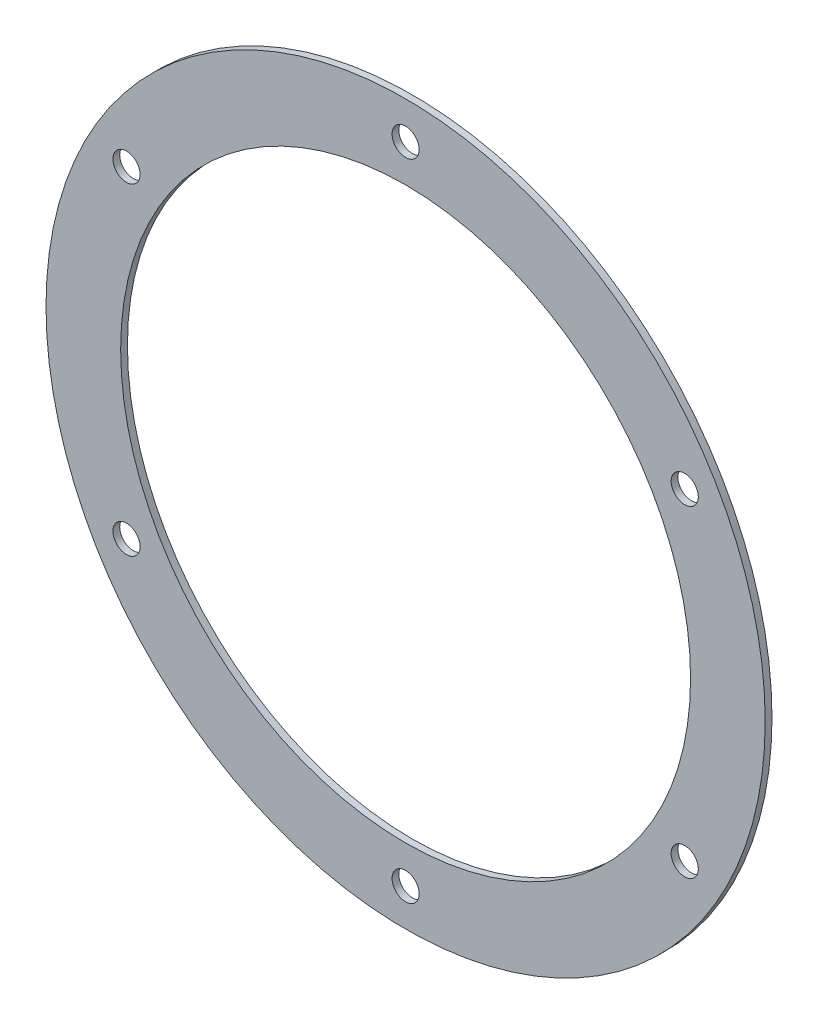
ISO-10303-21;
HEADER;
FILE_DESCRIPTION(('STEP AP214'),'2;1');
FILE_NAME('part.step','',(''),(''),'','','');
FILE_SCHEMA(('AUTOMOTIVE_DESIGN { 1 0 10303 214 1 1 1 1 }'));
ENDSEC;
DATA;
#1=APPLICATION_CONTEXT('core data for automotive mechanical design processes');
#2=APPLICATION_PROTOCOL_DEFINITION('international standard','automotive_design',2000,#1);
#3=PRODUCT_CONTEXT('',#1,'mechanical');
#4=PRODUCT('Part','Part','',(#3));
#5=PRODUCT_RELATED_PRODUCT_CATEGORY('part','',(#4));
#6=PRODUCT_DEFINITION_FORMATION('','',#4);
#7=PRODUCT_DEFINITION_CONTEXT('part definition',#1,'design');
#8=PRODUCT_DEFINITION('design','',#6,#7);
#9=PRODUCT_DEFINITION_SHAPE('','',#8);
#10=(LENGTH_UNIT() NAMED_UNIT(*) SI_UNIT(.MILLI.,.METRE.));
#11=(NAMED_UNIT(*) PLANE_ANGLE_UNIT() SI_UNIT($,.RADIAN.));
#12=(NAMED_UNIT(*) SI_UNIT($,.STERADIAN.) SOLID_ANGLE_UNIT());
#13=UNCERTAINTY_MEASURE_WITH_UNIT(LENGTH_MEASURE(1.E-05),#10,'distance_accuracy_value','');
#14=(GEOMETRIC_REPRESENTATION_CONTEXT(3) GLOBAL_UNCERTAINTY_ASSIGNED_CONTEXT((#13)) GLOBAL_UNIT_ASSIGNED_CONTEXT((#10,
#11,#12)) REPRESENTATION_CONTEXT('',''));
#15=CARTESIAN_POINT('',(0.,0.,0.));
#16=DIRECTION('',(0.,0.,1.));
#17=DIRECTION('',(1.,0.,0.));
#18=AXIS2_PLACEMENT_3D('',#15,#16,#17);
#19=CARTESIAN_POINT('',(0.,0.,1.));
#20=DIRECTION('',(0.,0.,-1.));
#21=DIRECTION('',(-1.,0.,0.));
#22=AXIS2_PLACEMENT_3D('',#19,#20,#21);
#23=CYLINDRICAL_SURFACE('',#22,53.);
#24=CARTESIAN_POINT('',(0.,0.,1.));
#25=DIRECTION('',(0.,0.,1.));
#26=DIRECTION('',(1.,0.,0.));
#27=AXIS2_PLACEMENT_3D('',#24,#25,#26);
#28=CIRCLE('',#27,53.);
#29=CARTESIAN_POINT('',(53.,0.,1.));
#30=VERTEX_POINT('',#29);
#31=EDGE_CURVE('E11',#30,#30,#28,.T.);
#32=ORIENTED_EDGE('',*,*,#31,.F.);
#33=EDGE_LOOP('',(#32));
#34=FACE_BOUND('',#33,.T.);
#35=CARTESIAN_POINT('',(0.,0.,0.));
#36=DIRECTION('',(0.,0.,1.));
#37=DIRECTION('',(1.,0.,0.));
#38=AXIS2_PLACEMENT_3D('',#35,#36,#37);
#39=CIRCLE('',#38,53.);
#40=CARTESIAN_POINT('',(53.,0.,0.));
#41=VERTEX_POINT('',#40);
#42=EDGE_CURVE('E86',#41,#41,#39,.T.);
#43=ORIENTED_EDGE('',*,*,#42,.T.);
#44=EDGE_LOOP('',(#43));
#45=FACE_BOUND('',#44,.T.);
#46=ADVANCED_FACE('F83',(#34,#45),#23,.T.);
#47=CARTESIAN_POINT('',(0.,0.,1.));
#48=DIRECTION('',(0.,0.,1.));
#49=DIRECTION('',(1.,0.,0.));
#50=AXIS2_PLACEMENT_3D('',#47,#48,#49);
#51=PLANE('',#50);
#52=CARTESIAN_POINT('',(-41.1362066797649,-23.7499999999977,1.));
#53=DIRECTION('',(0.,0.,1.));
#54=DIRECTION('',(1.,0.,0.));
#55=AXIS2_PLACEMENT_3D('',#52,#53,#54);
#56=CIRCLE('',#55,2.);
#57=CARTESIAN_POINT('',(-43.1362066797649,-23.7499999999977,1.));
#58=VERTEX_POINT('',#57);
#59=EDGE_CURVE('E95',#58,#58,#56,.T.);
#60=ORIENTED_EDGE('',*,*,#59,.F.);
#61=EDGE_LOOP('',(#60));
#62=FACE_BOUND('',#61,.T.);
#63=CARTESIAN_POINT('',(0.,0.,1.));
#64=DIRECTION('',(0.,0.,1.));
#65=DIRECTION('',(1.,0.,0.));
#66=AXIS2_PLACEMENT_3D('',#63,#64,#65);
#67=CIRCLE('',#66,42.);
#68=CARTESIAN_POINT('',(-42.,0.,1.));
#69=VERTEX_POINT('',#68);
#70=EDGE_CURVE('E100',#69,#69,#67,.T.);
#71=ORIENTED_EDGE('',*,*,#70,.F.);
#72=EDGE_LOOP('',(#71));
#73=FACE_BOUND('',#72,.T.);
#74=CARTESIAN_POINT('',(-5.38267357488891E-12,-47.5,1.));
#75=DIRECTION('',(0.,0.,1.));
#76=DIRECTION('',(1.,0.,0.));
#77=AXIS2_PLACEMENT_3D('',#74,#75,#76);
#78=CIRCLE('',#77,2.);
#79=CARTESIAN_POINT('',(-2.00000000000538,-47.5,1.));
#80=VERTEX_POINT('',#79);
#81=EDGE_CURVE('E104',#80,#80,#78,.T.);
#82=ORIENTED_EDGE('',*,*,#81,.F.);
#83=EDGE_LOOP('',(#82));
#84=FACE_BOUND('',#83,.T.);
#85=CARTESIAN_POINT('',(41.1362066797568,-23.7500000000023,1.));
#86=DIRECTION('',(0.,0.,1.));
#87=DIRECTION('',(1.,0.,0.));
#88=AXIS2_PLACEMENT_3D('',#85,#86,#87);
#89=CIRCLE('',#88,2.);
#90=CARTESIAN_POINT('',(39.1362066797568,-23.7500000000023,1.));
#91=VERTEX_POINT('',#90);
#92=EDGE_CURVE('E108',#91,#91,#89,.T.);
#93=ORIENTED_EDGE('',*,*,#92,.F.);
#94=EDGE_LOOP('',(#93));
#95=FACE_BOUND('',#94,.T.);
#96=CARTESIAN_POINT('',(0.,47.5,1.));
#97=DIRECTION('',(0.,0.,1.));
#98=DIRECTION('',(1.,0.,0.));
#99=AXIS2_PLACEMENT_3D('',#96,#97,#98);
#100=CIRCLE('',#99,2.);
#101=CARTESIAN_POINT('',(-2.,47.5,1.));
#102=VERTEX_POINT('',#101);
#103=EDGE_CURVE('E112',#102,#102,#100,.T.);
#104=ORIENTED_EDGE('',*,*,#103,.F.);
#105=EDGE_LOOP('',(#104));
#106=FACE_BOUND('',#105,.T.);
#107=CARTESIAN_POINT('',(-41.1362066797622,23.7500000000023,1.));
#108=DIRECTION('',(0.,0.,1.));
#109=DIRECTION('',(1.,0.,0.));
#110=AXIS2_PLACEMENT_3D('',#107,#108,#109);
#111=CIRCLE('',#110,2.);
#112=CARTESIAN_POINT('',(-43.1362066797622,23.7500000000023,1.));
#113=VERTEX_POINT('',#112);
#114=EDGE_CURVE('E116',#113,#113,#111,.T.);
#115=ORIENTED_EDGE('',*,*,#114,.F.);
#116=EDGE_LOOP('',(#115));
#117=FACE_BOUND('',#116,.T.);
#118=CARTESIAN_POINT('',(41.1362066797595,23.7499999999976,1.));
#119=DIRECTION('',(0.,0.,1.));
#120=DIRECTION('',(1.,0.,0.));
#121=AXIS2_PLACEMENT_3D('',#118,#119,#120);
#122=CIRCLE('',#121,2.);
#123=CARTESIAN_POINT('',(39.1362066797595,23.7499999999976,1.));
#124=VERTEX_POINT('',#123);
#125=EDGE_CURVE('E120',#124,#124,#122,.T.);
#126=ORIENTED_EDGE('',*,*,#125,.F.);
#127=EDGE_LOOP('',(#126));
#128=FACE_BOUND('',#127,.T.);
#129=ORIENTED_EDGE('',*,*,#31,.T.);
#130=EDGE_LOOP('',(#129));
#131=FACE_BOUND('',#130,.T.);
#132=ADVANCED_FACE('F159',(#62,#73,#84,#95,#106,#117,#128,#131),#51,.T.);
#133=CARTESIAN_POINT('',(0.,0.,0.));
#134=DIRECTION('',(0.,0.,1.));
#135=DIRECTION('',(1.,0.,0.));
#136=AXIS2_PLACEMENT_3D('',#133,#134,#135);
#137=PLANE('',#136);
#138=CARTESIAN_POINT('',(-41.1362066797649,-23.7499999999977,0.));
#139=DIRECTION('',(0.,0.,-1.));
#140=DIRECTION('',(-1.,0.,0.));
#141=AXIS2_PLACEMENT_3D('',#138,#139,#140);
#142=CIRCLE('',#141,2.);
#143=CARTESIAN_POINT('',(-43.1362066797649,-23.7499999999977,0.));
#144=VERTEX_POINT('',#143);
#145=EDGE_CURVE('E133',#144,#144,#142,.T.);
#146=ORIENTED_EDGE('',*,*,#145,.F.);
#147=EDGE_LOOP('',(#146));
#148=FACE_BOUND('',#147,.T.);
#149=CARTESIAN_POINT('',(0.,0.,0.));
#150=DIRECTION('',(0.,0.,-1.));
#151=DIRECTION('',(-1.,0.,0.));
#152=AXIS2_PLACEMENT_3D('',#149,#150,#151);
#153=CIRCLE('',#152,42.);
#154=CARTESIAN_POINT('',(-42.,0.,0.));
#155=VERTEX_POINT('',#154);
#156=EDGE_CURVE('E140',#155,#155,#153,.T.);
#157=ORIENTED_EDGE('',*,*,#156,.F.);
#158=EDGE_LOOP('',(#157));
#159=FACE_BOUND('',#158,.T.);
#160=CARTESIAN_POINT('',(-5.38267357488891E-12,-47.5,0.));
#161=DIRECTION('',(0.,0.,-1.));
#162=DIRECTION('',(-1.,0.,0.));
#163=AXIS2_PLACEMENT_3D('',#160,#161,#162);
#164=CIRCLE('',#163,2.);
#165=CARTESIAN_POINT('',(-2.00000000000538,-47.5,0.));
#166=VERTEX_POINT('',#165);
#167=EDGE_CURVE('E129',#166,#166,#164,.T.);
#168=ORIENTED_EDGE('',*,*,#167,.F.);
#169=EDGE_LOOP('',(#168));
#170=FACE_BOUND('',#169,.T.);
#171=CARTESIAN_POINT('',(41.1362066797568,-23.7500000000023,0.));
#172=DIRECTION('',(0.,0.,-1.));
#173=DIRECTION('',(-1.,0.,0.));
#174=AXIS2_PLACEMENT_3D('',#171,#172,#173);
#175=CIRCLE('',#174,2.);
#176=CARTESIAN_POINT('',(39.1362066797568,-23.7500000000023,0.));
#177=VERTEX_POINT('',#176);
#178=EDGE_CURVE('E128',#177,#177,#175,.T.);
#179=ORIENTED_EDGE('',*,*,#178,.F.);
#180=EDGE_LOOP('',(#179));
#181=FACE_BOUND('',#180,.T.);
#182=CARTESIAN_POINT('',(0.,47.5,0.));
#183=DIRECTION('',(0.,0.,-1.));
#184=DIRECTION('',(-1.,0.,0.));
#185=AXIS2_PLACEMENT_3D('',#182,#183,#184);
#186=CIRCLE('',#185,2.);
#187=CARTESIAN_POINT('',(-2.,47.5,0.));
#188=VERTEX_POINT('',#187);
#189=EDGE_CURVE('E144',#188,#188,#186,.T.);
#190=ORIENTED_EDGE('',*,*,#189,.F.);
#191=EDGE_LOOP('',(#190));
#192=FACE_BOUND('',#191,.T.);
#193=CARTESIAN_POINT('',(-41.1362066797622,23.7500000000023,0.));
#194=DIRECTION('',(0.,0.,-1.));
#195=DIRECTION('',(-1.,0.,0.));
#196=AXIS2_PLACEMENT_3D('',#193,#194,#195);
#197=CIRCLE('',#196,2.);
#198=CARTESIAN_POINT('',(-43.1362066797622,23.7500000000023,0.));
#199=VERTEX_POINT('',#198);
#200=EDGE_CURVE('E145',#199,#199,#197,.T.);
#201=ORIENTED_EDGE('',*,*,#200,.F.);
#202=EDGE_LOOP('',(#201));
#203=FACE_BOUND('',#202,.T.);
#204=CARTESIAN_POINT('',(41.1362066797595,23.7499999999976,0.));
#205=DIRECTION('',(0.,0.,-1.));
#206=DIRECTION('',(-1.,0.,0.));
#207=AXIS2_PLACEMENT_3D('',#204,#205,#206);
#208=CIRCLE('',#207,2.);
#209=CARTESIAN_POINT('',(39.1362066797595,23.7499999999976,0.));
#210=VERTEX_POINT('',#209);
#211=EDGE_CURVE('E124',#210,#210,#208,.T.);
#212=ORIENTED_EDGE('',*,*,#211,.F.);
#213=EDGE_LOOP('',(#212));
#214=FACE_BOUND('',#213,.T.);
#215=ORIENTED_EDGE('',*,*,#42,.F.);
#216=EDGE_LOOP('',(#215));
#217=FACE_BOUND('',#216,.T.);
#218=ADVANCED_FACE('F155',(#148,#159,#170,#181,#192,#203,#214,#217),#137,.F.);
#219=CARTESIAN_POINT('',(41.1362066797595,23.7499999999976,42.));
#220=DIRECTION('',(0.,0.,-1.));
#221=DIRECTION('',(-1.,0.,0.));
#222=AXIS2_PLACEMENT_3D('',#219,#220,#221);
#223=CYLINDRICAL_SURFACE('',#222,2.);
#224=CARTESIAN_POINT('',(39.1362066797595,23.7499999999976,1.));
#225=CARTESIAN_POINT('',(39.1362066797595,23.7499999999976,0.989583333333335));
#226=CARTESIAN_POINT('',(39.1362066797595,23.7499999999976,0.97916666666667));
#227=CARTESIAN_POINT('',(39.1362066797595,23.7499999999976,0.958333333333336));
#228=CARTESIAN_POINT('',(39.1362066797595,23.7499999999976,0.947916666666669));
#229=CARTESIAN_POINT('',(39.1362066797595,23.7499999999976,0.927083333333333));
#230=CARTESIAN_POINT('',(39.1362066797595,23.7499999999976,0.916666666666665));
#231=CARTESIAN_POINT('',(39.1362066797595,23.7499999999976,0.895833333333332));
#232=CARTESIAN_POINT('',(39.1362066797595,23.7499999999976,0.885416666666666));
#233=CARTESIAN_POINT('',(39.1362066797595,23.7499999999976,0.864583333333335));
#234=CARTESIAN_POINT('',(39.1362066797595,23.7499999999976,0.85416666666667));
#235=CARTESIAN_POINT('',(39.1362066797595,23.7499999999976,0.833333333333336));
#236=CARTESIAN_POINT('',(39.1362066797595,23.7499999999976,0.822916666666669));
#237=CARTESIAN_POINT('',(39.1362066797595,23.7499999999976,0.802083333333333));
#238=CARTESIAN_POINT('',(39.1362066797595,23.7499999999976,0.791666666666665));
#239=CARTESIAN_POINT('',(39.1362066797595,23.7499999999976,0.770833333333332));
#240=CARTESIAN_POINT('',(39.1362066797595,23.7499999999976,0.760416666666666));
#241=CARTESIAN_POINT('',(39.1362066797595,23.7499999999976,0.739583333333335));
#242=CARTESIAN_POINT('',(39.1362066797595,23.7499999999976,0.72916666666667));
#243=CARTESIAN_POINT('',(39.1362066797595,23.7499999999976,0.708333333333336));
#244=CARTESIAN_POINT('',(39.1362066797595,23.7499999999976,0.697916666666668));
#245=CARTESIAN_POINT('',(39.1362066797595,23.7499999999976,0.677083333333333));
#246=CARTESIAN_POINT('',(39.1362066797595,23.7499999999976,0.666666666666665));
#247=CARTESIAN_POINT('',(39.1362066797595,23.7499999999976,0.645833333333332));
#248=CARTESIAN_POINT('',(39.1362066797595,23.7499999999976,0.635416666666666));
#249=CARTESIAN_POINT('',(39.1362066797595,23.7499999999976,0.614583333333335));
#250=CARTESIAN_POINT('',(39.1362066797595,23.7499999999976,0.60416666666667));
#251=CARTESIAN_POINT('',(39.1362066797595,23.7499999999976,0.583333333333336));
#252=CARTESIAN_POINT('',(39.1362066797595,23.7499999999976,0.572916666666668));
#253=CARTESIAN_POINT('',(39.1362066797595,23.7499999999976,0.552083333333333));
#254=CARTESIAN_POINT('',(39.1362066797595,23.7499999999976,0.541666666666665));
#255=CARTESIAN_POINT('',(39.1362066797595,23.7499999999976,0.520833333333331));
#256=CARTESIAN_POINT('',(39.1362066797595,23.7499999999976,0.510416666666666));
#257=CARTESIAN_POINT('',(39.1362066797595,23.7499999999976,0.489583333333335));
#258=CARTESIAN_POINT('',(39.1362066797595,23.7499999999976,0.479166666666669));
#259=CARTESIAN_POINT('',(39.1362066797595,23.7499999999976,0.458333333333336));
#260=CARTESIAN_POINT('',(39.1362066797595,23.7499999999976,0.447916666666668));
#261=CARTESIAN_POINT('',(39.1362066797595,23.7499999999976,0.427083333333333));
#262=CARTESIAN_POINT('',(39.1362066797595,23.7499999999976,0.416666666666665));
#263=CARTESIAN_POINT('',(39.1362066797595,23.7499999999976,0.395833333333331));
#264=CARTESIAN_POINT('',(39.1362066797595,23.7499999999976,0.385416666666666));
#265=CARTESIAN_POINT('',(39.1362066797595,23.7499999999976,0.364583333333335));
#266=CARTESIAN_POINT('',(39.1362066797595,23.7499999999976,0.354166666666669));
#267=CARTESIAN_POINT('',(39.1362066797595,23.7499999999976,0.333333333333336));
#268=CARTESIAN_POINT('',(39.1362066797595,23.7499999999976,0.322916666666668));
#269=CARTESIAN_POINT('',(39.1362066797595,23.7499999999976,0.302083333333332));
#270=CARTESIAN_POINT('',(39.1362066797595,23.7499999999976,0.291666666666665));
#271=CARTESIAN_POINT('',(39.1362066797595,23.7499999999976,0.270833333333331));
#272=CARTESIAN_POINT('',(39.1362066797595,23.7499999999976,0.260416666666666));
#273=CARTESIAN_POINT('',(39.1362066797595,23.7499999999976,0.239583333333335));
#274=CARTESIAN_POINT('',(39.1362066797595,23.7499999999976,0.229166666666669));
#275=CARTESIAN_POINT('',(39.1362066797595,23.7499999999976,0.208333333333336));
#276=CARTESIAN_POINT('',(39.1362066797595,23.7499999999976,0.197916666666668));
#277=CARTESIAN_POINT('',(39.1362066797595,23.7499999999976,0.177083333333332));
#278=CARTESIAN_POINT('',(39.1362066797595,23.7499999999976,0.166666666666664));
#279=CARTESIAN_POINT('',(39.1362066797595,23.7499999999976,0.145833333333331));
#280=CARTESIAN_POINT('',(39.1362066797595,23.7499999999976,0.135416666666666));
#281=CARTESIAN_POINT('',(39.1362066797595,23.7499999999976,0.114583333333335));
#282=CARTESIAN_POINT('',(39.1362066797595,23.7499999999976,0.104166666666669));
#283=CARTESIAN_POINT('',(39.1362066797595,23.7499999999976,0.0833333333333357));
#284=CARTESIAN_POINT('',(39.1362066797595,23.7499999999976,0.0729166666666679));
#285=CARTESIAN_POINT('',(39.1362066797595,23.7499999999976,0.0520833333333322));
#286=CARTESIAN_POINT('',(39.1362066797595,23.7499999999976,0.0416666666666644));
#287=CARTESIAN_POINT('',(39.1362066797595,23.7499999999976,0.020833333333331));
#288=CARTESIAN_POINT('',(39.1362066797595,23.7499999999976,0.0104166666666655));
#289=CARTESIAN_POINT('',(39.1362066797595,23.7499999999976,0.));
#290=B_SPLINE_CURVE_WITH_KNOTS('',3,(#224,#225,#226,#227,#228,#229,#230,#231,#232,#233,#234,
#235,#236,#237,#238,#239,#240,#241,#242,#243,#244,#245,#246,#247,#248,#249,#250,#251,#252,#253,
#254,#255,#256,#257,#258,#259,#260,#261,#262,#263,#264,#265,#266,#267,#268,#269,#270,#271,#272,
#273,#274,#275,#276,#277,#278,#279,#280,#281,#282,#283,#284,#285,#286,#287,#288,#289),
.UNSPECIFIED.,.F.,.F.,(4,2,2,2,2,2,2,2,2,2,2,2,2,2,2,2,2,2,2,2,2,2,2,2,2,2,2,2,2,2,2,2,4),(0.,
0.0312499999999966,0.0625000000000001,0.0937500000000036,0.125,0.156249999999997,0.1875,
0.218750000000004,0.25,0.281249999999997,0.3125,0.343750000000004,0.375,0.406249999999997,
0.4375,0.468750000000004,0.5,0.531249999999997,0.5625,0.593750000000004,0.625000000000001,
0.656249999999997,0.687500000000001,0.718750000000004,0.750000000000001,0.781249999999997,
0.812500000000001,0.843750000000004,0.875000000000001,0.906249999999997,0.937500000000001,
0.968750000000004,1.),.UNSPECIFIED.);
#291=EDGE_CURVE('BSEAM158',#124,#210,#290,.T.);
#292=ORIENTED_EDGE('',*,*,#125,.T.);
#293=ORIENTED_EDGE('',*,*,#211,.T.);
#294=ORIENTED_EDGE('',*,*,#291,.T.);
#295=ORIENTED_EDGE('',*,*,#291,.F.);
#296=EDGE_LOOP('',(#292,#294,#293,#295));
#297=FACE_BOUND('',#296,.T.);
#298=ADVANCED_FACE('F158',(#297),#223,.F.);
#299=CARTESIAN_POINT('',(-41.1362066797622,23.7500000000023,42.));
#300=DIRECTION('',(0.,0.,-1.));
#301=DIRECTION('',(-1.,0.,0.));
#302=AXIS2_PLACEMENT_3D('',#299,#300,#301);
#303=CYLINDRICAL_SURFACE('',#302,2.);
#304=CARTESIAN_POINT('',(-43.1362066797622,23.7500000000023,1.));
#305=CARTESIAN_POINT('',(-43.1362066797622,23.7500000000023,0.989583333333335));
#306=CARTESIAN_POINT('',(-43.1362066797622,23.7500000000023,0.97916666666667));
#307=CARTESIAN_POINT('',(-43.1362066797622,23.7500000000023,0.958333333333336));
#308=CARTESIAN_POINT('',(-43.1362066797622,23.7500000000023,0.947916666666669));
#309=CARTESIAN_POINT('',(-43.1362066797622,23.7500000000023,0.927083333333333));
#310=CARTESIAN_POINT('',(-43.1362066797622,23.7500000000023,0.916666666666665));
#311=CARTESIAN_POINT('',(-43.1362066797622,23.7500000000023,0.895833333333332));
#312=CARTESIAN_POINT('',(-43.1362066797622,23.7500000000023,0.885416666666666));
#313=CARTESIAN_POINT('',(-43.1362066797622,23.7500000000023,0.864583333333335));
#314=CARTESIAN_POINT('',(-43.1362066797622,23.7500000000023,0.85416666666667));
#315=CARTESIAN_POINT('',(-43.1362066797622,23.7500000000023,0.833333333333336));
#316=CARTESIAN_POINT('',(-43.1362066797622,23.7500000000023,0.822916666666669));
#317=CARTESIAN_POINT('',(-43.1362066797622,23.7500000000023,0.802083333333333));
#318=CARTESIAN_POINT('',(-43.1362066797622,23.7500000000023,0.791666666666665));
#319=CARTESIAN_POINT('',(-43.1362066797622,23.7500000000023,0.770833333333332));
#320=CARTESIAN_POINT('',(-43.1362066797622,23.7500000000023,0.760416666666666));
#321=CARTESIAN_POINT('',(-43.1362066797622,23.7500000000023,0.739583333333335));
#322=CARTESIAN_POINT('',(-43.1362066797622,23.7500000000023,0.72916666666667));
#323=CARTESIAN_POINT('',(-43.1362066797622,23.7500000000023,0.708333333333336));
#324=CARTESIAN_POINT('',(-43.1362066797622,23.7500000000023,0.697916666666668));
#325=CARTESIAN_POINT('',(-43.1362066797622,23.7500000000023,0.677083333333333));
#326=CARTESIAN_POINT('',(-43.1362066797622,23.7500000000023,0.666666666666665));
#327=CARTESIAN_POINT('',(-43.1362066797622,23.7500000000023,0.645833333333332));
#328=CARTESIAN_POINT('',(-43.1362066797622,23.7500000000023,0.635416666666666));
#329=CARTESIAN_POINT('',(-43.1362066797622,23.7500000000023,0.614583333333335));
#330=CARTESIAN_POINT('',(-43.1362066797622,23.7500000000023,0.60416666666667));
#331=CARTESIAN_POINT('',(-43.1362066797622,23.7500000000023,0.583333333333336));
#332=CARTESIAN_POINT('',(-43.1362066797622,23.7500000000023,0.572916666666668));
#333=CARTESIAN_POINT('',(-43.1362066797622,23.7500000000023,0.552083333333333));
#334=CARTESIAN_POINT('',(-43.1362066797622,23.7500000000023,0.541666666666665));
#335=CARTESIAN_POINT('',(-43.1362066797622,23.7500000000023,0.520833333333331));
#336=CARTESIAN_POINT('',(-43.1362066797622,23.7500000000023,0.510416666666666));
#337=CARTESIAN_POINT('',(-43.1362066797622,23.7500000000023,0.489583333333335));
#338=CARTESIAN_POINT('',(-43.1362066797622,23.7500000000023,0.479166666666669));
#339=CARTESIAN_POINT('',(-43.1362066797622,23.7500000000023,0.458333333333336));
#340=CARTESIAN_POINT('',(-43.1362066797622,23.7500000000023,0.447916666666668));
#341=CARTESIAN_POINT('',(-43.1362066797622,23.7500000000023,0.427083333333333));
#342=CARTESIAN_POINT('',(-43.1362066797622,23.7500000000023,0.416666666666665));
#343=CARTESIAN_POINT('',(-43.1362066797622,23.7500000000023,0.395833333333331));
#344=CARTESIAN_POINT('',(-43.1362066797622,23.7500000000023,0.385416666666666));
#345=CARTESIAN_POINT('',(-43.1362066797622,23.7500000000023,0.364583333333335));
#346=CARTESIAN_POINT('',(-43.1362066797622,23.7500000000023,0.354166666666669));
#347=CARTESIAN_POINT('',(-43.1362066797622,23.7500000000023,0.333333333333336));
#348=CARTESIAN_POINT('',(-43.1362066797622,23.7500000000023,0.322916666666668));
#349=CARTESIAN_POINT('',(-43.1362066797622,23.7500000000023,0.302083333333332));
#350=CARTESIAN_POINT('',(-43.1362066797622,23.7500000000023,0.291666666666665));
#351=CARTESIAN_POINT('',(-43.1362066797622,23.7500000000023,0.270833333333331));
#352=CARTESIAN_POINT('',(-43.1362066797622,23.7500000000023,0.260416666666666));
#353=CARTESIAN_POINT('',(-43.1362066797622,23.7500000000023,0.239583333333335));
#354=CARTESIAN_POINT('',(-43.1362066797622,23.7500000000023,0.229166666666669));
#355=CARTESIAN_POINT('',(-43.1362066797622,23.7500000000023,0.208333333333336));
#356=CARTESIAN_POINT('',(-43.1362066797622,23.7500000000023,0.197916666666668));
#357=CARTESIAN_POINT('',(-43.1362066797622,23.7500000000023,0.177083333333332));
#358=CARTESIAN_POINT('',(-43.1362066797622,23.7500000000023,0.166666666666664));
#359=CARTESIAN_POINT('',(-43.1362066797622,23.7500000000023,0.145833333333331));
#360=CARTESIAN_POINT('',(-43.1362066797622,23.7500000000023,0.135416666666666));
#361=CARTESIAN_POINT('',(-43.1362066797622,23.7500000000023,0.114583333333335));
#362=CARTESIAN_POINT('',(-43.1362066797622,23.7500000000023,0.104166666666669));
#363=CARTESIAN_POINT('',(-43.1362066797622,23.7500000000023,0.0833333333333357));
#364=CARTESIAN_POINT('',(-43.1362066797622,23.7500000000023,0.0729166666666679));
#365=CARTESIAN_POINT('',(-43.1362066797622,23.7500000000023,0.0520833333333322));
#366=CARTESIAN_POINT('',(-43.1362066797622,23.7500000000023,0.0416666666666644));
#367=CARTESIAN_POINT('',(-43.1362066797622,23.7500000000023,0.020833333333331));
#368=CARTESIAN_POINT('',(-43.1362066797622,23.7500000000023,0.0104166666666655));
#369=CARTESIAN_POINT('',(-43.1362066797622,23.7500000000023,0.));
#370=B_SPLINE_CURVE_WITH_KNOTS('',3,(#304,#305,#306,#307,#308,#309,#310,#311,#312,#313,#314,
#315,#316,#317,#318,#319,#320,#321,#322,#323,#324,#325,#326,#327,#328,#329,#330,#331,#332,#333,
#334,#335,#336,#337,#338,#339,#340,#341,#342,#343,#344,#345,#346,#347,#348,#349,#350,#351,#352,
#353,#354,#355,#356,#357,#358,#359,#360,#361,#362,#363,#364,#365,#366,#367,#368,#369),
.UNSPECIFIED.,.F.,.F.,(4,2,2,2,2,2,2,2,2,2,2,2,2,2,2,2,2,2,2,2,2,2,2,2,2,2,2,2,2,2,2,2,4),(0.,
0.0312499999999966,0.0625000000000001,0.0937500000000036,0.125,0.156249999999997,0.1875,
0.218750000000004,0.25,0.281249999999997,0.3125,0.343750000000004,0.375,0.406249999999997,
0.4375,0.468750000000004,0.5,0.531249999999997,0.5625,0.593750000000004,0.625000000000001,
0.656249999999997,0.687500000000001,0.718750000000004,0.750000000000001,0.781249999999997,
0.812500000000001,0.843750000000004,0.875000000000001,0.906249999999997,0.937500000000001,
0.968750000000004,1.),.UNSPECIFIED.);
#371=EDGE_CURVE('BSEAM181',#113,#199,#370,.T.);
#372=ORIENTED_EDGE('',*,*,#114,.T.);
#373=ORIENTED_EDGE('',*,*,#200,.T.);
#374=ORIENTED_EDGE('',*,*,#371,.T.);
#375=ORIENTED_EDGE('',*,*,#371,.F.);
#376=EDGE_LOOP('',(#372,#374,#373,#375));
#377=FACE_BOUND('',#376,.T.);
#378=ADVANCED_FACE('F181',(#377),#303,.F.);
#379=CARTESIAN_POINT('',(0.,47.5,42.));
#380=DIRECTION('',(0.,0.,-1.));
#381=DIRECTION('',(-1.,0.,0.));
#382=AXIS2_PLACEMENT_3D('',#379,#380,#381);
#383=CYLINDRICAL_SURFACE('',#382,2.);
#384=CARTESIAN_POINT('',(-2.,47.5,1.));
#385=CARTESIAN_POINT('',(-2.,47.5,0.989583333333335));
#386=CARTESIAN_POINT('',(-2.,47.5,0.97916666666667));
#387=CARTESIAN_POINT('',(-2.,47.5,0.958333333333336));
#388=CARTESIAN_POINT('',(-2.,47.5,0.947916666666669));
#389=CARTESIAN_POINT('',(-2.,47.5,0.927083333333333));
#390=CARTESIAN_POINT('',(-2.,47.5,0.916666666666665));
#391=CARTESIAN_POINT('',(-2.,47.5,0.895833333333332));
#392=CARTESIAN_POINT('',(-2.,47.5,0.885416666666666));
#393=CARTESIAN_POINT('',(-2.,47.5,0.864583333333335));
#394=CARTESIAN_POINT('',(-2.,47.5,0.85416666666667));
#395=CARTESIAN_POINT('',(-2.,47.5,0.833333333333336));
#396=CARTESIAN_POINT('',(-2.,47.5,0.822916666666669));
#397=CARTESIAN_POINT('',(-2.,47.5,0.802083333333333));
#398=CARTESIAN_POINT('',(-2.,47.5,0.791666666666665));
#399=CARTESIAN_POINT('',(-2.,47.5,0.770833333333332));
#400=CARTESIAN_POINT('',(-2.,47.5,0.760416666666666));
#401=CARTESIAN_POINT('',(-2.,47.5,0.739583333333335));
#402=CARTESIAN_POINT('',(-2.,47.5,0.72916666666667));
#403=CARTESIAN_POINT('',(-2.,47.5,0.708333333333336));
#404=CARTESIAN_POINT('',(-2.,47.5,0.697916666666668));
#405=CARTESIAN_POINT('',(-2.,47.5,0.677083333333333));
#406=CARTESIAN_POINT('',(-2.,47.5,0.666666666666665));
#407=CARTESIAN_POINT('',(-2.,47.5,0.645833333333332));
#408=CARTESIAN_POINT('',(-2.,47.5,0.635416666666666));
#409=CARTESIAN_POINT('',(-2.,47.5,0.614583333333335));
#410=CARTESIAN_POINT('',(-2.,47.5,0.60416666666667));
#411=CARTESIAN_POINT('',(-2.,47.5,0.583333333333336));
#412=CARTESIAN_POINT('',(-2.,47.5,0.572916666666668));
#413=CARTESIAN_POINT('',(-2.,47.5,0.552083333333333));
#414=CARTESIAN_POINT('',(-2.,47.5,0.541666666666665));
#415=CARTESIAN_POINT('',(-2.,47.5,0.520833333333331));
#416=CARTESIAN_POINT('',(-2.,47.5,0.510416666666666));
#417=CARTESIAN_POINT('',(-2.,47.5,0.489583333333335));
#418=CARTESIAN_POINT('',(-2.,47.5,0.479166666666669));
#419=CARTESIAN_POINT('',(-2.,47.5,0.458333333333336));
#420=CARTESIAN_POINT('',(-2.,47.5,0.447916666666668));
#421=CARTESIAN_POINT('',(-2.,47.5,0.427083333333333));
#422=CARTESIAN_POINT('',(-2.,47.5,0.416666666666665));
#423=CARTESIAN_POINT('',(-2.,47.5,0.395833333333331));
#424=CARTESIAN_POINT('',(-2.,47.5,0.385416666666666));
#425=CARTESIAN_POINT('',(-2.,47.5,0.364583333333335));
#426=CARTESIAN_POINT('',(-2.,47.5,0.354166666666669));
#427=CARTESIAN_POINT('',(-2.,47.5,0.333333333333336));
#428=CARTESIAN_POINT('',(-2.,47.5,0.322916666666668));
#429=CARTESIAN_POINT('',(-2.,47.5,0.302083333333332));
#430=CARTESIAN_POINT('',(-2.,47.5,0.291666666666665));
#431=CARTESIAN_POINT('',(-2.,47.5,0.270833333333331));
#432=CARTESIAN_POINT('',(-2.,47.5,0.260416666666666));
#433=CARTESIAN_POINT('',(-2.,47.5,0.239583333333335));
#434=CARTESIAN_POINT('',(-2.,47.5,0.229166666666669));
#435=CARTESIAN_POINT('',(-2.,47.5,0.208333333333336));
#436=CARTESIAN_POINT('',(-2.,47.5,0.197916666666668));
#437=CARTESIAN_POINT('',(-2.,47.5,0.177083333333332));
#438=CARTESIAN_POINT('',(-2.,47.5,0.166666666666664));
#439=CARTESIAN_POINT('',(-2.,47.5,0.145833333333331));
#440=CARTESIAN_POINT('',(-2.,47.5,0.135416666666666));
#441=CARTESIAN_POINT('',(-2.,47.5,0.114583333333335));
#442=CARTESIAN_POINT('',(-2.,47.5,0.104166666666669));
#443=CARTESIAN_POINT('',(-2.,47.5,0.0833333333333357));
#444=CARTESIAN_POINT('',(-2.,47.5,0.0729166666666679));
#445=CARTESIAN_POINT('',(-2.,47.5,0.0520833333333322));
#446=CARTESIAN_POINT('',(-2.,47.5,0.0416666666666644));
#447=CARTESIAN_POINT('',(-2.,47.5,0.020833333333331));
#448=CARTESIAN_POINT('',(-2.,47.5,0.0104166666666655));
#449=CARTESIAN_POINT('',(-2.,47.5,0.));
#450=B_SPLINE_CURVE_WITH_KNOTS('',3,(#384,#385,#386,#387,#388,#389,#390,#391,#392,#393,#394,
#395,#396,#397,#398,#399,#400,#401,#402,#403,#404,#405,#406,#407,#408,#409,#410,#411,#412,#413,
#414,#415,#416,#417,#418,#419,#420,#421,#422,#423,#424,#425,#426,#427,#428,#429,#430,#431,#432,
#433,#434,#435,#436,#437,#438,#439,#440,#441,#442,#443,#444,#445,#446,#447,#448,#449),
.UNSPECIFIED.,.F.,.F.,(4,2,2,2,2,2,2,2,2,2,2,2,2,2,2,2,2,2,2,2,2,2,2,2,2,2,2,2,2,2,2,2,4),(0.,
0.0312499999999966,0.0625000000000001,0.0937500000000036,0.125,0.156249999999997,0.1875,
0.218750000000004,0.25,0.281249999999997,0.3125,0.343750000000004,0.375,0.406249999999997,
0.4375,0.468750000000004,0.5,0.531249999999997,0.5625,0.593750000000004,0.625000000000001,
0.656249999999997,0.687500000000001,0.718750000000004,0.750000000000001,0.781249999999997,
0.812500000000001,0.843750000000004,0.875000000000001,0.906249999999997,0.937500000000001,
0.968750000000004,1.),.UNSPECIFIED.);
#451=EDGE_CURVE('BSEAM153',#102,#188,#450,.T.);
#452=ORIENTED_EDGE('',*,*,#103,.T.);
#453=ORIENTED_EDGE('',*,*,#189,.T.);
#454=ORIENTED_EDGE('',*,*,#451,.T.);
#455=ORIENTED_EDGE('',*,*,#451,.F.);
#456=EDGE_LOOP('',(#452,#454,#453,#455));
#457=FACE_BOUND('',#456,.T.);
#458=ADVANCED_FACE('F153',(#457),#383,.F.);
#459=CARTESIAN_POINT('',(41.1362066797568,-23.7500000000023,42.));
#460=DIRECTION('',(0.,0.,-1.));
#461=DIRECTION('',(-1.,0.,0.));
#462=AXIS2_PLACEMENT_3D('',#459,#460,#461);
#463=CYLINDRICAL_SURFACE('',#462,2.);
#464=CARTESIAN_POINT('',(39.1362066797568,-23.7500000000023,1.));
#465=CARTESIAN_POINT('',(39.1362066797568,-23.7500000000023,0.989583333333335));
#466=CARTESIAN_POINT('',(39.1362066797568,-23.7500000000023,0.97916666666667));
#467=CARTESIAN_POINT('',(39.1362066797568,-23.7500000000023,0.958333333333336));
#468=CARTESIAN_POINT('',(39.1362066797568,-23.7500000000023,0.947916666666669));
#469=CARTESIAN_POINT('',(39.1362066797568,-23.7500000000023,0.927083333333333));
#470=CARTESIAN_POINT('',(39.1362066797568,-23.7500000000023,0.916666666666665));
#471=CARTESIAN_POINT('',(39.1362066797568,-23.7500000000023,0.895833333333332));
#472=CARTESIAN_POINT('',(39.1362066797568,-23.7500000000023,0.885416666666666));
#473=CARTESIAN_POINT('',(39.1362066797568,-23.7500000000023,0.864583333333335));
#474=CARTESIAN_POINT('',(39.1362066797568,-23.7500000000023,0.85416666666667));
#475=CARTESIAN_POINT('',(39.1362066797568,-23.7500000000023,0.833333333333336));
#476=CARTESIAN_POINT('',(39.1362066797568,-23.7500000000023,0.822916666666669));
#477=CARTESIAN_POINT('',(39.1362066797568,-23.7500000000023,0.802083333333333));
#478=CARTESIAN_POINT('',(39.1362066797568,-23.7500000000023,0.791666666666665));
#479=CARTESIAN_POINT('',(39.1362066797568,-23.7500000000023,0.770833333333332));
#480=CARTESIAN_POINT('',(39.1362066797568,-23.7500000000023,0.760416666666666));
#481=CARTESIAN_POINT('',(39.1362066797568,-23.7500000000023,0.739583333333335));
#482=CARTESIAN_POINT('',(39.1362066797568,-23.7500000000023,0.72916666666667));
#483=CARTESIAN_POINT('',(39.1362066797568,-23.7500000000023,0.708333333333336));
#484=CARTESIAN_POINT('',(39.1362066797568,-23.7500000000023,0.697916666666668));
#485=CARTESIAN_POINT('',(39.1362066797568,-23.7500000000023,0.677083333333333));
#486=CARTESIAN_POINT('',(39.1362066797568,-23.7500000000023,0.666666666666665));
#487=CARTESIAN_POINT('',(39.1362066797568,-23.7500000000023,0.645833333333332));
#488=CARTESIAN_POINT('',(39.1362066797568,-23.7500000000023,0.635416666666666));
#489=CARTESIAN_POINT('',(39.1362066797568,-23.7500000000023,0.614583333333335));
#490=CARTESIAN_POINT('',(39.1362066797568,-23.7500000000023,0.60416666666667));
#491=CARTESIAN_POINT('',(39.1362066797568,-23.7500000000023,0.583333333333336));
#492=CARTESIAN_POINT('',(39.1362066797568,-23.7500000000023,0.572916666666668));
#493=CARTESIAN_POINT('',(39.1362066797568,-23.7500000000023,0.552083333333333));
#494=CARTESIAN_POINT('',(39.1362066797568,-23.7500000000023,0.541666666666665));
#495=CARTESIAN_POINT('',(39.1362066797568,-23.7500000000023,0.520833333333331));
#496=CARTESIAN_POINT('',(39.1362066797568,-23.7500000000023,0.510416666666666));
#497=CARTESIAN_POINT('',(39.1362066797568,-23.7500000000023,0.489583333333335));
#498=CARTESIAN_POINT('',(39.1362066797568,-23.7500000000023,0.479166666666669));
#499=CARTESIAN_POINT('',(39.1362066797568,-23.7500000000023,0.458333333333336));
#500=CARTESIAN_POINT('',(39.1362066797568,-23.7500000000023,0.447916666666668));
#501=CARTESIAN_POINT('',(39.1362066797568,-23.7500000000023,0.427083333333333));
#502=CARTESIAN_POINT('',(39.1362066797568,-23.7500000000023,0.416666666666665));
#503=CARTESIAN_POINT('',(39.1362066797568,-23.7500000000023,0.395833333333331));
#504=CARTESIAN_POINT('',(39.1362066797568,-23.7500000000023,0.385416666666666));
#505=CARTESIAN_POINT('',(39.1362066797568,-23.7500000000023,0.364583333333335));
#506=CARTESIAN_POINT('',(39.1362066797568,-23.7500000000023,0.354166666666669));
#507=CARTESIAN_POINT('',(39.1362066797568,-23.7500000000023,0.333333333333336));
#508=CARTESIAN_POINT('',(39.1362066797568,-23.7500000000023,0.322916666666668));
#509=CARTESIAN_POINT('',(39.1362066797568,-23.7500000000023,0.302083333333332));
#510=CARTESIAN_POINT('',(39.1362066797568,-23.7500000000023,0.291666666666665));
#511=CARTESIAN_POINT('',(39.1362066797568,-23.7500000000023,0.270833333333331));
#512=CARTESIAN_POINT('',(39.1362066797568,-23.7500000000023,0.260416666666666));
#513=CARTESIAN_POINT('',(39.1362066797568,-23.7500000000023,0.239583333333335));
#514=CARTESIAN_POINT('',(39.1362066797568,-23.7500000000023,0.229166666666669));
#515=CARTESIAN_POINT('',(39.1362066797568,-23.7500000000023,0.208333333333336));
#516=CARTESIAN_POINT('',(39.1362066797568,-23.7500000000023,0.197916666666668));
#517=CARTESIAN_POINT('',(39.1362066797568,-23.7500000000023,0.177083333333332));
#518=CARTESIAN_POINT('',(39.1362066797568,-23.7500000000023,0.166666666666664));
#519=CARTESIAN_POINT('',(39.1362066797568,-23.7500000000023,0.145833333333331));
#520=CARTESIAN_POINT('',(39.1362066797568,-23.7500000000023,0.135416666666666));
#521=CARTESIAN_POINT('',(39.1362066797568,-23.7500000000023,0.114583333333335));
#522=CARTESIAN_POINT('',(39.1362066797568,-23.7500000000023,0.104166666666669));
#523=CARTESIAN_POINT('',(39.1362066797568,-23.7500000000023,0.0833333333333357));
#524=CARTESIAN_POINT('',(39.1362066797568,-23.7500000000023,0.0729166666666679));
#525=CARTESIAN_POINT('',(39.1362066797568,-23.7500000000023,0.0520833333333322));
#526=CARTESIAN_POINT('',(39.1362066797568,-23.7500000000023,0.0416666666666644));
#527=CARTESIAN_POINT('',(39.1362066797568,-23.7500000000023,0.020833333333331));
#528=CARTESIAN_POINT('',(39.1362066797568,-23.7500000000023,0.0104166666666655));
#529=CARTESIAN_POINT('',(39.1362066797568,-23.7500000000023,0.));
#530=B_SPLINE_CURVE_WITH_KNOTS('',3,(#464,#465,#466,#467,#468,#469,#470,#471,#472,#473,#474,
#475,#476,#477,#478,#479,#480,#481,#482,#483,#484,#485,#486,#487,#488,#489,#490,#491,#492,#493,
#494,#495,#496,#497,#498,#499,#500,#501,#502,#503,#504,#505,#506,#507,#508,#509,#510,#511,#512,
#513,#514,#515,#516,#517,#518,#519,#520,#521,#522,#523,#524,#525,#526,#527,#528,#529),
.UNSPECIFIED.,.F.,.F.,(4,2,2,2,2,2,2,2,2,2,2,2,2,2,2,2,2,2,2,2,2,2,2,2,2,2,2,2,2,2,2,2,4),(0.,
0.0312499999999966,0.0625000000000001,0.0937500000000036,0.125,0.156249999999997,0.1875,
0.218750000000004,0.25,0.281249999999997,0.3125,0.343750000000004,0.375,0.406249999999997,
0.4375,0.468750000000004,0.5,0.531249999999997,0.5625,0.593750000000004,0.625000000000001,
0.656249999999997,0.687500000000001,0.718750000000004,0.750000000000001,0.781249999999997,
0.812500000000001,0.843750000000004,0.875000000000001,0.906249999999997,0.937500000000001,
0.968750000000004,1.),.UNSPECIFIED.);
#531=EDGE_CURVE('BSEAM187',#91,#177,#530,.T.);
#532=ORIENTED_EDGE('',*,*,#92,.T.);
#533=ORIENTED_EDGE('',*,*,#178,.T.);
#534=ORIENTED_EDGE('',*,*,#531,.T.);
#535=ORIENTED_EDGE('',*,*,#531,.F.);
#536=EDGE_LOOP('',(#532,#534,#533,#535));
#537=FACE_BOUND('',#536,.T.);
#538=ADVANCED_FACE('F187',(#537),#463,.F.);
#539=CARTESIAN_POINT('',(-5.38267357488891E-12,-47.5,42.));
#540=DIRECTION('',(0.,0.,-1.));
#541=DIRECTION('',(-1.,0.,0.));
#542=AXIS2_PLACEMENT_3D('',#539,#540,#541);
#543=CYLINDRICAL_SURFACE('',#542,2.);
#544=CARTESIAN_POINT('',(-2.00000000000538,-47.5,1.));
#545=CARTESIAN_POINT('',(-2.00000000000538,-47.5,0.989583333333335));
#546=CARTESIAN_POINT('',(-2.00000000000538,-47.5,0.97916666666667));
#547=CARTESIAN_POINT('',(-2.00000000000538,-47.5,0.958333333333336));
#548=CARTESIAN_POINT('',(-2.00000000000538,-47.5,0.947916666666669));
#549=CARTESIAN_POINT('',(-2.00000000000538,-47.5,0.927083333333333));
#550=CARTESIAN_POINT('',(-2.00000000000538,-47.5,0.916666666666665));
#551=CARTESIAN_POINT('',(-2.00000000000538,-47.5,0.895833333333332));
#552=CARTESIAN_POINT('',(-2.00000000000538,-47.5,0.885416666666666));
#553=CARTESIAN_POINT('',(-2.00000000000538,-47.5,0.864583333333335));
#554=CARTESIAN_POINT('',(-2.00000000000538,-47.5,0.85416666666667));
#555=CARTESIAN_POINT('',(-2.00000000000538,-47.5,0.833333333333336));
#556=CARTESIAN_POINT('',(-2.00000000000538,-47.5,0.822916666666669));
#557=CARTESIAN_POINT('',(-2.00000000000538,-47.5,0.802083333333333));
#558=CARTESIAN_POINT('',(-2.00000000000538,-47.5,0.791666666666665));
#559=CARTESIAN_POINT('',(-2.00000000000538,-47.5,0.770833333333332));
#560=CARTESIAN_POINT('',(-2.00000000000538,-47.5,0.760416666666666));
#561=CARTESIAN_POINT('',(-2.00000000000538,-47.5,0.739583333333335));
#562=CARTESIAN_POINT('',(-2.00000000000538,-47.5,0.72916666666667));
#563=CARTESIAN_POINT('',(-2.00000000000538,-47.5,0.708333333333336));
#564=CARTESIAN_POINT('',(-2.00000000000538,-47.5,0.697916666666668));
#565=CARTESIAN_POINT('',(-2.00000000000538,-47.5,0.677083333333333));
#566=CARTESIAN_POINT('',(-2.00000000000538,-47.5,0.666666666666665));
#567=CARTESIAN_POINT('',(-2.00000000000538,-47.5,0.645833333333332));
#568=CARTESIAN_POINT('',(-2.00000000000538,-47.5,0.635416666666666));
#569=CARTESIAN_POINT('',(-2.00000000000538,-47.5,0.614583333333335));
#570=CARTESIAN_POINT('',(-2.00000000000538,-47.5,0.60416666666667));
#571=CARTESIAN_POINT('',(-2.00000000000538,-47.5,0.583333333333336));
#572=CARTESIAN_POINT('',(-2.00000000000538,-47.5,0.572916666666668));
#573=CARTESIAN_POINT('',(-2.00000000000538,-47.5,0.552083333333333));
#574=CARTESIAN_POINT('',(-2.00000000000538,-47.5,0.541666666666665));
#575=CARTESIAN_POINT('',(-2.00000000000538,-47.5,0.520833333333331));
#576=CARTESIAN_POINT('',(-2.00000000000538,-47.5,0.510416666666666));
#577=CARTESIAN_POINT('',(-2.00000000000538,-47.5,0.489583333333335));
#578=CARTESIAN_POINT('',(-2.00000000000538,-47.5,0.479166666666669));
#579=CARTESIAN_POINT('',(-2.00000000000538,-47.5,0.458333333333336));
#580=CARTESIAN_POINT('',(-2.00000000000538,-47.5,0.447916666666668));
#581=CARTESIAN_POINT('',(-2.00000000000538,-47.5,0.427083333333333));
#582=CARTESIAN_POINT('',(-2.00000000000538,-47.5,0.416666666666665));
#583=CARTESIAN_POINT('',(-2.00000000000538,-47.5,0.395833333333331));
#584=CARTESIAN_POINT('',(-2.00000000000538,-47.5,0.385416666666666));
#585=CARTESIAN_POINT('',(-2.00000000000538,-47.5,0.364583333333335));
#586=CARTESIAN_POINT('',(-2.00000000000538,-47.5,0.354166666666669));
#587=CARTESIAN_POINT('',(-2.00000000000538,-47.5,0.333333333333336));
#588=CARTESIAN_POINT('',(-2.00000000000538,-47.5,0.322916666666668));
#589=CARTESIAN_POINT('',(-2.00000000000538,-47.5,0.302083333333332));
#590=CARTESIAN_POINT('',(-2.00000000000538,-47.5,0.291666666666665));
#591=CARTESIAN_POINT('',(-2.00000000000538,-47.5,0.270833333333331));
#592=CARTESIAN_POINT('',(-2.00000000000538,-47.5,0.260416666666666));
#593=CARTESIAN_POINT('',(-2.00000000000538,-47.5,0.239583333333335));
#594=CARTESIAN_POINT('',(-2.00000000000538,-47.5,0.229166666666669));
#595=CARTESIAN_POINT('',(-2.00000000000538,-47.5,0.208333333333336));
#596=CARTESIAN_POINT('',(-2.00000000000538,-47.5,0.197916666666668));
#597=CARTESIAN_POINT('',(-2.00000000000538,-47.5,0.177083333333332));
#598=CARTESIAN_POINT('',(-2.00000000000538,-47.5,0.166666666666664));
#599=CARTESIAN_POINT('',(-2.00000000000538,-47.5,0.145833333333331));
#600=CARTESIAN_POINT('',(-2.00000000000538,-47.5,0.135416666666666));
#601=CARTESIAN_POINT('',(-2.00000000000538,-47.5,0.114583333333335));
#602=CARTESIAN_POINT('',(-2.00000000000538,-47.5,0.104166666666669));
#603=CARTESIAN_POINT('',(-2.00000000000538,-47.5,0.0833333333333357));
#604=CARTESIAN_POINT('',(-2.00000000000538,-47.5,0.0729166666666679));
#605=CARTESIAN_POINT('',(-2.00000000000538,-47.5,0.0520833333333322));
#606=CARTESIAN_POINT('',(-2.00000000000538,-47.5,0.0416666666666644));
#607=CARTESIAN_POINT('',(-2.00000000000538,-47.5,0.020833333333331));
#608=CARTESIAN_POINT('',(-2.00000000000538,-47.5,0.0104166666666655));
#609=CARTESIAN_POINT('',(-2.00000000000538,-47.5,0.));
#610=B_SPLINE_CURVE_WITH_KNOTS('',3,(#544,#545,#546,#547,#548,#549,#550,#551,#552,#553,#554,
#555,#556,#557,#558,#559,#560,#561,#562,#563,#564,#565,#566,#567,#568,#569,#570,#571,#572,#573,
#574,#575,#576,#577,#578,#579,#580,#581,#582,#583,#584,#585,#586,#587,#588,#589,#590,#591,#592,
#593,#594,#595,#596,#597,#598,#599,#600,#601,#602,#603,#604,#605,#606,#607,#608,#609),
.UNSPECIFIED.,.F.,.F.,(4,2,2,2,2,2,2,2,2,2,2,2,2,2,2,2,2,2,2,2,2,2,2,2,2,2,2,2,2,2,2,2,4),(0.,
0.0312499999999966,0.0625000000000001,0.0937500000000036,0.125,0.156249999999997,0.1875,
0.218750000000004,0.25,0.281249999999997,0.3125,0.343750000000004,0.375,0.406249999999997,
0.4375,0.468750000000004,0.5,0.531249999999997,0.5625,0.593750000000004,0.625000000000001,
0.656249999999997,0.687500000000001,0.718750000000004,0.750000000000001,0.781249999999997,
0.812500000000001,0.843750000000004,0.875000000000001,0.906249999999997,0.937500000000001,
0.968750000000004,1.),.UNSPECIFIED.);
#611=EDGE_CURVE('BSEAM183',#80,#166,#610,.T.);
#612=ORIENTED_EDGE('',*,*,#81,.T.);
#613=ORIENTED_EDGE('',*,*,#167,.T.);
#614=ORIENTED_EDGE('',*,*,#611,.T.);
#615=ORIENTED_EDGE('',*,*,#611,.F.);
#616=EDGE_LOOP('',(#612,#614,#613,#615));
#617=FACE_BOUND('',#616,.T.);
#618=ADVANCED_FACE('F183',(#617),#543,.F.);
#619=CARTESIAN_POINT('',(0.,0.,42.));
#620=DIRECTION('',(0.,0.,-1.));
#621=DIRECTION('',(-1.,0.,0.));
#622=AXIS2_PLACEMENT_3D('',#619,#620,#621);
#623=CYLINDRICAL_SURFACE('',#622,42.);
#624=CARTESIAN_POINT('',(-42.,0.,1.));
#625=CARTESIAN_POINT('',(-42.,0.,0.989583333333335));
#626=CARTESIAN_POINT('',(-42.,0.,0.97916666666667));
#627=CARTESIAN_POINT('',(-42.,0.,0.958333333333336));
#628=CARTESIAN_POINT('',(-42.,0.,0.947916666666669));
#629=CARTESIAN_POINT('',(-42.,0.,0.927083333333333));
#630=CARTESIAN_POINT('',(-42.,0.,0.916666666666665));
#631=CARTESIAN_POINT('',(-42.,0.,0.895833333333332));
#632=CARTESIAN_POINT('',(-42.,0.,0.885416666666666));
#633=CARTESIAN_POINT('',(-42.,0.,0.864583333333335));
#634=CARTESIAN_POINT('',(-42.,0.,0.85416666666667));
#635=CARTESIAN_POINT('',(-42.,0.,0.833333333333336));
#636=CARTESIAN_POINT('',(-42.,0.,0.822916666666669));
#637=CARTESIAN_POINT('',(-42.,0.,0.802083333333333));
#638=CARTESIAN_POINT('',(-42.,0.,0.791666666666665));
#639=CARTESIAN_POINT('',(-42.,0.,0.770833333333332));
#640=CARTESIAN_POINT('',(-42.,0.,0.760416666666666));
#641=CARTESIAN_POINT('',(-42.,0.,0.739583333333335));
#642=CARTESIAN_POINT('',(-42.,0.,0.72916666666667));
#643=CARTESIAN_POINT('',(-42.,0.,0.708333333333336));
#644=CARTESIAN_POINT('',(-42.,0.,0.697916666666668));
#645=CARTESIAN_POINT('',(-42.,0.,0.677083333333333));
#646=CARTESIAN_POINT('',(-42.,0.,0.666666666666665));
#647=CARTESIAN_POINT('',(-42.,0.,0.645833333333332));
#648=CARTESIAN_POINT('',(-42.,0.,0.635416666666666));
#649=CARTESIAN_POINT('',(-42.,0.,0.614583333333335));
#650=CARTESIAN_POINT('',(-42.,0.,0.60416666666667));
#651=CARTESIAN_POINT('',(-42.,0.,0.583333333333336));
#652=CARTESIAN_POINT('',(-42.,0.,0.572916666666668));
#653=CARTESIAN_POINT('',(-42.,0.,0.552083333333333));
#654=CARTESIAN_POINT('',(-42.,0.,0.541666666666665));
#655=CARTESIAN_POINT('',(-42.,0.,0.520833333333331));
#656=CARTESIAN_POINT('',(-42.,0.,0.510416666666666));
#657=CARTESIAN_POINT('',(-42.,0.,0.489583333333335));
#658=CARTESIAN_POINT('',(-42.,0.,0.479166666666669));
#659=CARTESIAN_POINT('',(-42.,0.,0.458333333333336));
#660=CARTESIAN_POINT('',(-42.,0.,0.447916666666668));
#661=CARTESIAN_POINT('',(-42.,0.,0.427083333333333));
#662=CARTESIAN_POINT('',(-42.,0.,0.416666666666665));
#663=CARTESIAN_POINT('',(-42.,0.,0.395833333333331));
#664=CARTESIAN_POINT('',(-42.,0.,0.385416666666666));
#665=CARTESIAN_POINT('',(-42.,0.,0.364583333333335));
#666=CARTESIAN_POINT('',(-42.,0.,0.354166666666669));
#667=CARTESIAN_POINT('',(-42.,0.,0.333333333333336));
#668=CARTESIAN_POINT('',(-42.,0.,0.322916666666668));
#669=CARTESIAN_POINT('',(-42.,0.,0.302083333333332));
#670=CARTESIAN_POINT('',(-42.,0.,0.291666666666665));
#671=CARTESIAN_POINT('',(-42.,0.,0.270833333333331));
#672=CARTESIAN_POINT('',(-42.,0.,0.260416666666666));
#673=CARTESIAN_POINT('',(-42.,0.,0.239583333333335));
#674=CARTESIAN_POINT('',(-42.,0.,0.229166666666669));
#675=CARTESIAN_POINT('',(-42.,0.,0.208333333333336));
#676=CARTESIAN_POINT('',(-42.,0.,0.197916666666668));
#677=CARTESIAN_POINT('',(-42.,0.,0.177083333333332));
#678=CARTESIAN_POINT('',(-42.,0.,0.166666666666664));
#679=CARTESIAN_POINT('',(-42.,0.,0.145833333333331));
#680=CARTESIAN_POINT('',(-42.,0.,0.135416666666666));
#681=CARTESIAN_POINT('',(-42.,0.,0.114583333333335));
#682=CARTESIAN_POINT('',(-42.,0.,0.104166666666669));
#683=CARTESIAN_POINT('',(-42.,0.,0.0833333333333357));
#684=CARTESIAN_POINT('',(-42.,0.,0.0729166666666679));
#685=CARTESIAN_POINT('',(-42.,0.,0.0520833333333322));
#686=CARTESIAN_POINT('',(-42.,0.,0.0416666666666644));
#687=CARTESIAN_POINT('',(-42.,0.,0.020833333333331));
#688=CARTESIAN_POINT('',(-42.,0.,0.0104166666666655));
#689=CARTESIAN_POINT('',(-42.,0.,0.));
#690=B_SPLINE_CURVE_WITH_KNOTS('',3,(#624,#625,#626,#627,#628,#629,#630,#631,#632,#633,#634,
#635,#636,#637,#638,#639,#640,#641,#642,#643,#644,#645,#646,#647,#648,#649,#650,#651,#652,#653,
#654,#655,#656,#657,#658,#659,#660,#661,#662,#663,#664,#665,#666,#667,#668,#669,#670,#671,#672,
#673,#674,#675,#676,#677,#678,#679,#680,#681,#682,#683,#684,#685,#686,#687,#688,#689),
.UNSPECIFIED.,.F.,.F.,(4,2,2,2,2,2,2,2,2,2,2,2,2,2,2,2,2,2,2,2,2,2,2,2,2,2,2,2,2,2,2,2,4),(0.,
0.0312499999999966,0.0625000000000001,0.0937500000000036,0.125,0.156249999999997,0.1875,
0.218750000000004,0.25,0.281249999999997,0.3125,0.343750000000004,0.375,0.406249999999997,
0.4375,0.468750000000004,0.5,0.531249999999997,0.5625,0.593750000000004,0.625000000000001,
0.656249999999997,0.687500000000001,0.718750000000004,0.750000000000001,0.781249999999997,
0.812500000000001,0.843750000000004,0.875000000000001,0.906249999999997,0.937500000000001,
0.968750000000004,1.),.UNSPECIFIED.);
#691=EDGE_CURVE('BSEAM186',#69,#155,#690,.T.);
#692=ORIENTED_EDGE('',*,*,#70,.T.);
#693=ORIENTED_EDGE('',*,*,#156,.T.);
#694=ORIENTED_EDGE('',*,*,#691,.T.);
#695=ORIENTED_EDGE('',*,*,#691,.F.);
#696=EDGE_LOOP('',(#692,#694,#693,#695));
#697=FACE_BOUND('',#696,.T.);
#698=ADVANCED_FACE('F186',(#697),#623,.F.);
#699=CARTESIAN_POINT('',(-41.1362066797649,-23.7499999999977,42.));
#700=DIRECTION('',(0.,0.,-1.));
#701=DIRECTION('',(-1.,0.,0.));
#702=AXIS2_PLACEMENT_3D('',#699,#700,#701);
#703=CYLINDRICAL_SURFACE('',#702,2.);
#704=CARTESIAN_POINT('',(-43.1362066797649,-23.7499999999977,1.));
#705=CARTESIAN_POINT('',(-43.1362066797649,-23.7499999999977,0.989583333333335));
#706=CARTESIAN_POINT('',(-43.1362066797649,-23.7499999999977,0.97916666666667));
#707=CARTESIAN_POINT('',(-43.1362066797649,-23.7499999999977,0.958333333333336));
#708=CARTESIAN_POINT('',(-43.1362066797649,-23.7499999999977,0.947916666666669));
#709=CARTESIAN_POINT('',(-43.1362066797649,-23.7499999999977,0.927083333333333));
#710=CARTESIAN_POINT('',(-43.1362066797649,-23.7499999999977,0.916666666666665));
#711=CARTESIAN_POINT('',(-43.1362066797649,-23.7499999999977,0.895833333333332));
#712=CARTESIAN_POINT('',(-43.1362066797649,-23.7499999999977,0.885416666666666));
#713=CARTESIAN_POINT('',(-43.1362066797649,-23.7499999999977,0.864583333333335));
#714=CARTESIAN_POINT('',(-43.1362066797649,-23.7499999999977,0.85416666666667));
#715=CARTESIAN_POINT('',(-43.1362066797649,-23.7499999999977,0.833333333333336));
#716=CARTESIAN_POINT('',(-43.1362066797649,-23.7499999999977,0.822916666666669));
#717=CARTESIAN_POINT('',(-43.1362066797649,-23.7499999999977,0.802083333333333));
#718=CARTESIAN_POINT('',(-43.1362066797649,-23.7499999999977,0.791666666666665));
#719=CARTESIAN_POINT('',(-43.1362066797649,-23.7499999999977,0.770833333333332));
#720=CARTESIAN_POINT('',(-43.1362066797649,-23.7499999999977,0.760416666666666));
#721=CARTESIAN_POINT('',(-43.1362066797649,-23.7499999999977,0.739583333333335));
#722=CARTESIAN_POINT('',(-43.1362066797649,-23.7499999999977,0.72916666666667));
#723=CARTESIAN_POINT('',(-43.1362066797649,-23.7499999999977,0.708333333333336));
#724=CARTESIAN_POINT('',(-43.1362066797649,-23.7499999999977,0.697916666666668));
#725=CARTESIAN_POINT('',(-43.1362066797649,-23.7499999999977,0.677083333333333));
#726=CARTESIAN_POINT('',(-43.1362066797649,-23.7499999999977,0.666666666666665));
#727=CARTESIAN_POINT('',(-43.1362066797649,-23.7499999999977,0.645833333333332));
#728=CARTESIAN_POINT('',(-43.1362066797649,-23.7499999999977,0.635416666666666));
#729=CARTESIAN_POINT('',(-43.1362066797649,-23.7499999999977,0.614583333333335));
#730=CARTESIAN_POINT('',(-43.1362066797649,-23.7499999999977,0.60416666666667));
#731=CARTESIAN_POINT('',(-43.1362066797649,-23.7499999999977,0.583333333333336));
#732=CARTESIAN_POINT('',(-43.1362066797649,-23.7499999999977,0.572916666666668));
#733=CARTESIAN_POINT('',(-43.1362066797649,-23.7499999999977,0.552083333333333));
#734=CARTESIAN_POINT('',(-43.1362066797649,-23.7499999999977,0.541666666666665));
#735=CARTESIAN_POINT('',(-43.1362066797649,-23.7499999999977,0.520833333333331));
#736=CARTESIAN_POINT('',(-43.1362066797649,-23.7499999999977,0.510416666666666));
#737=CARTESIAN_POINT('',(-43.1362066797649,-23.7499999999977,0.489583333333335));
#738=CARTESIAN_POINT('',(-43.1362066797649,-23.7499999999977,0.479166666666669));
#739=CARTESIAN_POINT('',(-43.1362066797649,-23.7499999999977,0.458333333333336));
#740=CARTESIAN_POINT('',(-43.1362066797649,-23.7499999999977,0.447916666666668));
#741=CARTESIAN_POINT('',(-43.1362066797649,-23.7499999999977,0.427083333333333));
#742=CARTESIAN_POINT('',(-43.1362066797649,-23.7499999999977,0.416666666666665));
#743=CARTESIAN_POINT('',(-43.1362066797649,-23.7499999999977,0.395833333333331));
#744=CARTESIAN_POINT('',(-43.1362066797649,-23.7499999999977,0.385416666666666));
#745=CARTESIAN_POINT('',(-43.1362066797649,-23.7499999999977,0.364583333333335));
#746=CARTESIAN_POINT('',(-43.1362066797649,-23.7499999999977,0.354166666666669));
#747=CARTESIAN_POINT('',(-43.1362066797649,-23.7499999999977,0.333333333333336));
#748=CARTESIAN_POINT('',(-43.1362066797649,-23.7499999999977,0.322916666666668));
#749=CARTESIAN_POINT('',(-43.1362066797649,-23.7499999999977,0.302083333333332));
#750=CARTESIAN_POINT('',(-43.1362066797649,-23.7499999999977,0.291666666666665));
#751=CARTESIAN_POINT('',(-43.1362066797649,-23.7499999999977,0.270833333333331));
#752=CARTESIAN_POINT('',(-43.1362066797649,-23.7499999999977,0.260416666666666));
#753=CARTESIAN_POINT('',(-43.1362066797649,-23.7499999999977,0.239583333333335));
#754=CARTESIAN_POINT('',(-43.1362066797649,-23.7499999999977,0.229166666666669));
#755=CARTESIAN_POINT('',(-43.1362066797649,-23.7499999999977,0.208333333333336));
#756=CARTESIAN_POINT('',(-43.1362066797649,-23.7499999999977,0.197916666666668));
#757=CARTESIAN_POINT('',(-43.1362066797649,-23.7499999999977,0.177083333333332));
#758=CARTESIAN_POINT('',(-43.1362066797649,-23.7499999999977,0.166666666666664));
#759=CARTESIAN_POINT('',(-43.1362066797649,-23.7499999999977,0.145833333333331));
#760=CARTESIAN_POINT('',(-43.1362066797649,-23.7499999999977,0.135416666666666));
#761=CARTESIAN_POINT('',(-43.1362066797649,-23.7499999999977,0.114583333333335));
#762=CARTESIAN_POINT('',(-43.1362066797649,-23.7499999999977,0.104166666666669));
#763=CARTESIAN_POINT('',(-43.1362066797649,-23.7499999999977,0.0833333333333357));
#764=CARTESIAN_POINT('',(-43.1362066797649,-23.7499999999977,0.0729166666666679));
#765=CARTESIAN_POINT('',(-43.1362066797649,-23.7499999999977,0.0520833333333322));
#766=CARTESIAN_POINT('',(-43.1362066797649,-23.7499999999977,0.0416666666666644));
#767=CARTESIAN_POINT('',(-43.1362066797649,-23.7499999999977,0.020833333333331));
#768=CARTESIAN_POINT('',(-43.1362066797649,-23.7499999999977,0.0104166666666655));
#769=CARTESIAN_POINT('',(-43.1362066797649,-23.7499999999977,0.));
#770=B_SPLINE_CURVE_WITH_KNOTS('',3,(#704,#705,#706,#707,#708,#709,#710,#711,#712,#713,#714,
#715,#716,#717,#718,#719,#720,#721,#722,#723,#724,#725,#726,#727,#728,#729,#730,#731,#732,#733,
#734,#735,#736,#737,#738,#739,#740,#741,#742,#743,#744,#745,#746,#747,#748,#749,#750,#751,#752,
#753,#754,#755,#756,#757,#758,#759,#760,#761,#762,#763,#764,#765,#766,#767,#768,#769),
.UNSPECIFIED.,.F.,.F.,(4,2,2,2,2,2,2,2,2,2,2,2,2,2,2,2,2,2,2,2,2,2,2,2,2,2,2,2,2,2,2,2,4),(0.,
0.0312499999999966,0.0625000000000001,0.0937500000000036,0.125,0.156249999999997,0.1875,
0.218750000000004,0.25,0.281249999999997,0.3125,0.343750000000004,0.375,0.406249999999997,
0.4375,0.468750000000004,0.5,0.531249999999997,0.5625,0.593750000000004,0.625000000000001,
0.656249999999997,0.687500000000001,0.718750000000004,0.750000000000001,0.781249999999997,
0.812500000000001,0.843750000000004,0.875000000000001,0.906249999999997,0.937500000000001,
0.968750000000004,1.),.UNSPECIFIED.);
#771=EDGE_CURVE('BSEAM192',#58,#144,#770,.T.);
#772=ORIENTED_EDGE('',*,*,#59,.T.);
#773=ORIENTED_EDGE('',*,*,#145,.T.);
#774=ORIENTED_EDGE('',*,*,#771,.T.);
#775=ORIENTED_EDGE('',*,*,#771,.F.);
#776=EDGE_LOOP('',(#772,#774,#773,#775));
#777=FACE_BOUND('',#776,.T.);
#778=ADVANCED_FACE('F192',(#777),#703,.F.);
#779=CLOSED_SHELL('',(#46,#132,#218,#298,#378,#458,#538,#618,#698,#778));
#780=MANIFOLD_SOLID_BREP('B2',#779);
#781=ADVANCED_BREP_SHAPE_REPRESENTATION('',(#18,#780),#14);
#782=SHAPE_DEFINITION_REPRESENTATION(#9,#781);
ENDSEC;
END-ISO-10303-21;
